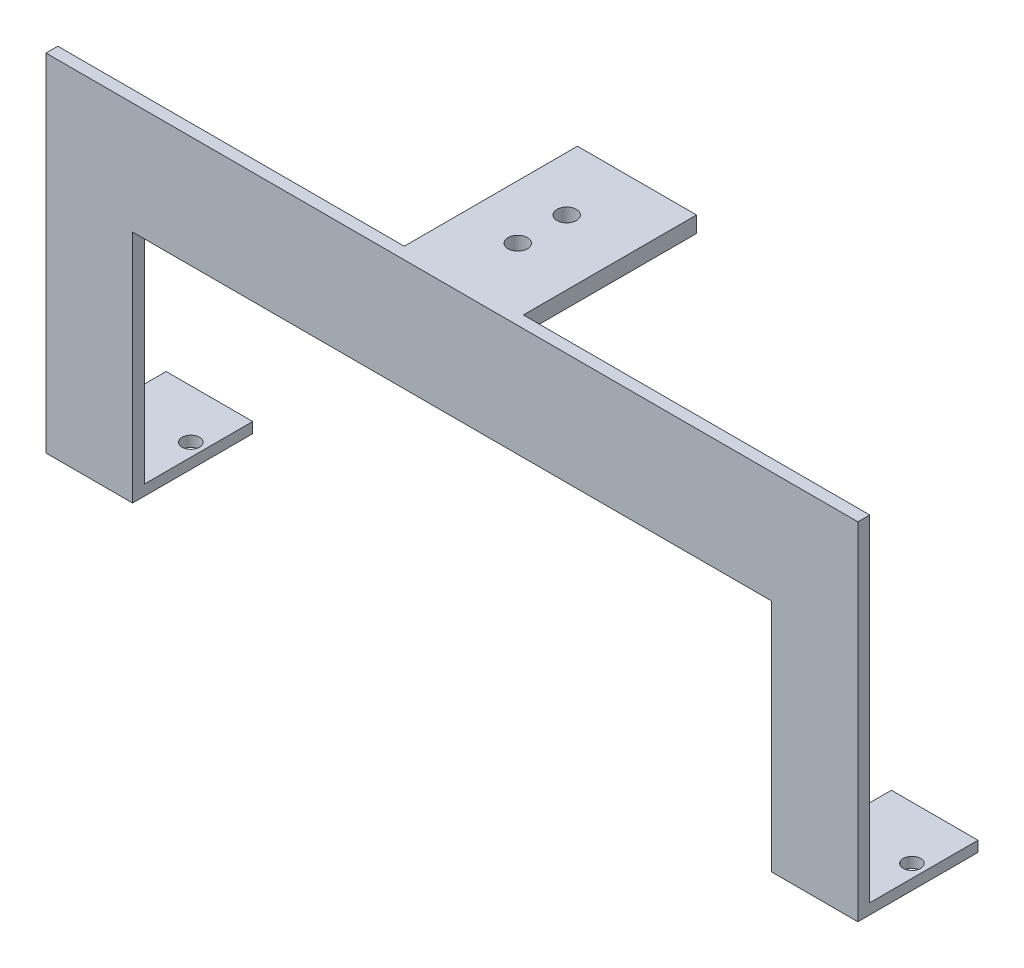
ISO-10303-21;
HEADER;
FILE_DESCRIPTION(('STEP AP214'),'2;1');
FILE_NAME('part.step','',(''),(''),'','','');
FILE_SCHEMA(('AUTOMOTIVE_DESIGN { 1 0 10303 214 1 1 1 1 }'));
ENDSEC;
DATA;
#1=APPLICATION_CONTEXT('core data for automotive mechanical design processes');
#2=APPLICATION_PROTOCOL_DEFINITION('international standard','automotive_design',2000,#1);
#3=PRODUCT_CONTEXT('',#1,'mechanical');
#4=PRODUCT('Part','Part','',(#3));
#5=PRODUCT_RELATED_PRODUCT_CATEGORY('part','',(#4));
#6=PRODUCT_DEFINITION_FORMATION('','',#4);
#7=PRODUCT_DEFINITION_CONTEXT('part definition',#1,'design');
#8=PRODUCT_DEFINITION('design','',#6,#7);
#9=PRODUCT_DEFINITION_SHAPE('','',#8);
#10=(LENGTH_UNIT() NAMED_UNIT(*) SI_UNIT(.MILLI.,.METRE.));
#11=(NAMED_UNIT(*) PLANE_ANGLE_UNIT() SI_UNIT($,.RADIAN.));
#12=(NAMED_UNIT(*) SI_UNIT($,.STERADIAN.) SOLID_ANGLE_UNIT());
#13=UNCERTAINTY_MEASURE_WITH_UNIT(LENGTH_MEASURE(1.E-05),#10,'distance_accuracy_value','');
#14=(GEOMETRIC_REPRESENTATION_CONTEXT(3) GLOBAL_UNCERTAINTY_ASSIGNED_CONTEXT((#13)) GLOBAL_UNIT_ASSIGNED_CONTEXT((#10,
#11,#12)) REPRESENTATION_CONTEXT('',''));
#15=CARTESIAN_POINT('',(0.,0.,0.));
#16=DIRECTION('',(0.,0.,1.));
#17=DIRECTION('',(1.,0.,0.));
#18=AXIS2_PLACEMENT_3D('',#15,#16,#17);
#19=CARTESIAN_POINT('',(0.,0.,0.));
#20=DIRECTION('',(0.,0.,1.));
#21=DIRECTION('',(1.,0.,0.));
#22=AXIS2_PLACEMENT_3D('',#19,#20,#21);
#23=PLANE('',#22);
#24=DIRECTION('',(0.,-1.,0.));
#25=VECTOR('',#24,1.);
#26=CARTESIAN_POINT('',(-37.7295436567423,75.8708638880561,0.));
#27=LINE('',#26,#25);
#28=CARTESIAN_POINT('',(-37.7295436567423,75.8708638880561,0.));
#29=VERTEX_POINT('',#28);
#30=CARTESIAN_POINT('',(-37.7295436567423,71.1610408886543,0.));
#31=VERTEX_POINT('',#30);
#32=EDGE_CURVE('E171',#29,#31,#27,.T.);
#33=ORIENTED_EDGE('',*,*,#32,.F.);
#34=DIRECTION('',(-1.,0.,0.));
#35=VECTOR('',#34,1.);
#36=CARTESIAN_POINT('',(-174.254543656742,75.870863888056,0.));
#37=LINE('',#36,#35);
#38=CARTESIAN_POINT('',(63.8704563432576,75.8708638880561,0.));
#39=VERTEX_POINT('',#38);
#40=EDGE_CURVE('E216',#39,#29,#37,.T.);
#41=ORIENTED_EDGE('',*,*,#40,.F.);
#42=DIRECTION('',(0.,1.,0.));
#43=VECTOR('',#42,1.);
#44=CARTESIAN_POINT('',(63.8704563432576,75.8708638880561,0.));
#45=LINE('',#44,#43);
#46=CARTESIAN_POINT('',(63.8704563432577,-22.6303361119439,0.));
#47=VERTEX_POINT('',#46);
#48=EDGE_CURVE('E240',#47,#39,#45,.T.);
#49=ORIENTED_EDGE('',*,*,#48,.F.);
#50=DIRECTION('',(1.,0.,0.));
#51=VECTOR('',#50,1.);
#52=CARTESIAN_POINT('',(63.8704563432577,-22.6303361119439,0.));
#53=LINE('',#52,#51);
#54=CARTESIAN_POINT('',(38.4704563432577,-22.6303361119439,0.));
#55=VERTEX_POINT('',#54);
#56=EDGE_CURVE('E192',#55,#47,#53,.T.);
#57=ORIENTED_EDGE('',*,*,#56,.F.);
#58=DIRECTION('',(0.,-1.,0.));
#59=VECTOR('',#58,1.);
#60=CARTESIAN_POINT('',(38.4704563432576,43.1046566031269,0.));
#61=LINE('',#60,#59);
#62=CARTESIAN_POINT('',(38.4704563432576,43.1046566031269,0.));
#63=VERTEX_POINT('',#62);
#64=EDGE_CURVE('E237',#63,#55,#61,.T.);
#65=ORIENTED_EDGE('',*,*,#64,.F.);
#66=DIRECTION('',(1.,0.,0.));
#67=VECTOR('',#66,1.);
#68=CARTESIAN_POINT('',(-148.854543656742,43.1046566031269,0.));
#69=LINE('',#68,#67);
#70=CARTESIAN_POINT('',(-148.854543656742,43.1046566031269,0.));
#71=VERTEX_POINT('',#70);
#72=EDGE_CURVE('E235',#71,#63,#69,.T.);
#73=ORIENTED_EDGE('',*,*,#72,.F.);
#74=DIRECTION('',(0.,1.,0.));
#75=VECTOR('',#74,1.);
#76=CARTESIAN_POINT('',(-148.854543656742,-25.7291361119439,0.));
#77=LINE('',#76,#75);
#78=CARTESIAN_POINT('',(-148.854543656742,-22.6303361119439,0.));
#79=VERTEX_POINT('',#78);
#80=EDGE_CURVE('E233',#79,#71,#77,.T.);
#81=ORIENTED_EDGE('',*,*,#80,.F.);
#82=DIRECTION('',(1.,0.,0.));
#83=VECTOR('',#82,1.);
#84=CARTESIAN_POINT('',(-148.854543656742,-22.6303361119439,0.));
#85=LINE('',#84,#83);
#86=CARTESIAN_POINT('',(-174.254543656742,-22.6303361119439,0.));
#87=VERTEX_POINT('',#86);
#88=EDGE_CURVE('E173',#87,#79,#85,.T.);
#89=ORIENTED_EDGE('',*,*,#88,.F.);
#90=DIRECTION('',(0.,-1.,0.));
#91=VECTOR('',#90,1.);
#92=CARTESIAN_POINT('',(-174.254543656742,75.870863888056,0.));
#93=LINE('',#92,#91);
#94=CARTESIAN_POINT('',(-174.254543656742,75.870863888056,0.));
#95=VERTEX_POINT('',#94);
#96=EDGE_CURVE('E211',#95,#87,#93,.T.);
#97=ORIENTED_EDGE('',*,*,#96,.F.);
#98=CARTESIAN_POINT('',(-72.6545436567424,75.870863888056,0.));
#99=VERTEX_POINT('',#98);
#100=EDGE_CURVE('E242',#99,#95,#37,.T.);
#101=ORIENTED_EDGE('',*,*,#100,.F.);
#102=DIRECTION('',(0.,1.,0.));
#103=VECTOR('',#102,1.);
#104=CARTESIAN_POINT('',(-72.6545436567424,75.870863888056,0.));
#105=LINE('',#104,#103);
#106=CARTESIAN_POINT('',(-72.6545436567424,71.1610408886543,0.));
#107=VERTEX_POINT('',#106);
#108=EDGE_CURVE('E167',#107,#99,#105,.T.);
#109=ORIENTED_EDGE('',*,*,#108,.F.);
#110=DIRECTION('',(-1.,0.,0.));
#111=VECTOR('',#110,1.);
#112=CARTESIAN_POINT('',(-37.7295436567423,71.1610408886543,0.));
#113=LINE('',#112,#111);
#114=EDGE_CURVE('E301',#31,#107,#113,.T.);
#115=ORIENTED_EDGE('',*,*,#114,.F.);
#116=EDGE_LOOP('',(#33,#41,#49,#57,#65,#73,#81,#89,#97,#101,#109,#115));
#117=FACE_BOUND('',#116,.T.);
#118=ADVANCED_FACE('F34',(#117),#23,.F.);
#119=CARTESIAN_POINT('',(-174.254543656742,75.870863888056,3.4798));
#120=DIRECTION('',(1.,0.,0.));
#121=DIRECTION('',(0.,1.,0.));
#122=AXIS2_PLACEMENT_3D('',#119,#120,#121);
#123=PLANE('',#122);
#124=ORIENTED_EDGE('',*,*,#96,.T.);
#125=DIRECTION('',(0.,0.,1.));
#126=VECTOR('',#125,1.);
#127=CARTESIAN_POINT('',(-174.254543656742,-22.6303361119439,-31.75));
#128=LINE('',#127,#126);
#129=CARTESIAN_POINT('',(-174.254543656742,-22.6303361119439,-31.75));
#130=VERTEX_POINT('',#129);
#131=EDGE_CURVE('E190',#130,#87,#128,.T.);
#132=ORIENTED_EDGE('',*,*,#131,.F.);
#133=DIRECTION('',(0.,1.,0.));
#134=VECTOR('',#133,1.);
#135=CARTESIAN_POINT('',(-174.254543656742,-22.6303361119439,-31.75));
#136=LINE('',#135,#134);
#137=CARTESIAN_POINT('',(-174.254543656742,-25.7291361119439,-31.75));
#138=VERTEX_POINT('',#137);
#139=EDGE_CURVE('E185',#138,#130,#136,.T.);
#140=ORIENTED_EDGE('',*,*,#139,.F.);
#141=DIRECTION('',(0.,0.,-1.));
#142=VECTOR('',#141,1.);
#143=CARTESIAN_POINT('',(-174.254543656742,-25.7291361119439,3.4798));
#144=LINE('',#143,#142);
#145=CARTESIAN_POINT('',(-174.254543656742,-25.7291361119439,3.4798));
#146=VERTEX_POINT('',#145);
#147=EDGE_CURVE('E11',#146,#138,#144,.T.);
#148=ORIENTED_EDGE('',*,*,#147,.F.);
#149=DIRECTION('',(0.,-1.,0.));
#150=VECTOR('',#149,1.);
#151=CARTESIAN_POINT('',(-174.254543656742,75.870863888056,3.4798));
#152=LINE('',#151,#150);
#153=CARTESIAN_POINT('',(-174.254543656742,75.870863888056,3.4798));
#154=VERTEX_POINT('',#153);
#155=EDGE_CURVE('E212',#154,#146,#152,.T.);
#156=ORIENTED_EDGE('',*,*,#155,.F.);
#157=DIRECTION('',(0.,0.,-1.));
#158=VECTOR('',#157,1.);
#159=CARTESIAN_POINT('',(-174.254543656742,75.870863888056,3.4798));
#160=LINE('',#159,#158);
#161=EDGE_CURVE('E230',#154,#95,#160,.T.);
#162=ORIENTED_EDGE('',*,*,#161,.T.);
#163=EDGE_LOOP('',(#124,#132,#140,#148,#156,#162));
#164=FACE_BOUND('',#163,.T.);
#165=ADVANCED_FACE('F36',(#164),#123,.F.);
#166=CARTESIAN_POINT('',(-174.254543656742,-25.7291361119439,3.4798));
#167=DIRECTION('',(0.,1.,0.));
#168=DIRECTION('',(0.,0.,1.));
#169=AXIS2_PLACEMENT_3D('',#166,#167,#168);
#170=PLANE('',#169);
#171=CARTESIAN_POINT('',(-152.664543656742,-25.7291361119439,-17.4042438171966));
#172=DIRECTION('',(0.,-1.,0.));
#173=DIRECTION('',(0.,0.,-1.));
#174=AXIS2_PLACEMENT_3D('',#171,#172,#173);
#175=CIRCLE('',#174,2.53999999999998);
#176=CARTESIAN_POINT('',(-152.664543656742,-25.7291361119439,-19.9442438171966));
#177=VERTEX_POINT('',#176);
#178=EDGE_CURVE('E272',#177,#177,#175,.T.);
#179=ORIENTED_EDGE('',*,*,#178,.F.);
#180=EDGE_LOOP('',(#179));
#181=FACE_BOUND('',#180,.T.);
#182=CARTESIAN_POINT('',(-170.444543656742,-25.7291361119439,-17.1376093775564));
#183=DIRECTION('',(0.,-1.,0.));
#184=DIRECTION('',(0.,0.,-1.));
#185=AXIS2_PLACEMENT_3D('',#182,#183,#184);
#186=CIRCLE('',#185,2.53999999999998);
#187=CARTESIAN_POINT('',(-170.444543656742,-25.7291361119439,-19.6776093775564));
#188=VERTEX_POINT('',#187);
#189=EDGE_CURVE('E268',#188,#188,#186,.T.);
#190=ORIENTED_EDGE('',*,*,#189,.F.);
#191=EDGE_LOOP('',(#190));
#192=FACE_BOUND('',#191,.T.);
#193=ORIENTED_EDGE('',*,*,#147,.T.);
#194=DIRECTION('',(-1.,0.,0.));
#195=VECTOR('',#194,1.);
#196=CARTESIAN_POINT('',(-148.854543656742,-25.7291361119439,-31.75));
#197=LINE('',#196,#195);
#198=CARTESIAN_POINT('',(-148.854543656742,-25.7291361119439,-31.75));
#199=VERTEX_POINT('',#198);
#200=EDGE_CURVE('E182',#199,#138,#197,.T.);
#201=ORIENTED_EDGE('',*,*,#200,.F.);
#202=DIRECTION('',(0.,0.,-1.));
#203=VECTOR('',#202,1.);
#204=CARTESIAN_POINT('',(-148.854543656742,-25.7291361119439,3.4798));
#205=LINE('',#204,#203);
#206=CARTESIAN_POINT('',(-148.854543656742,-25.7291361119439,3.4798));
#207=VERTEX_POINT('',#206);
#208=EDGE_CURVE('E43',#207,#199,#205,.T.);
#209=ORIENTED_EDGE('',*,*,#208,.F.);
#210=DIRECTION('',(1.,0.,0.));
#211=VECTOR('',#210,1.);
#212=CARTESIAN_POINT('',(-174.254543656742,-25.7291361119439,3.4798));
#213=LINE('',#212,#211);
#214=EDGE_CURVE('E215',#146,#207,#213,.T.);
#215=ORIENTED_EDGE('',*,*,#214,.F.);
#216=EDGE_LOOP('',(#193,#201,#209,#215));
#217=FACE_BOUND('',#216,.T.);
#218=ADVANCED_FACE('F343',(#181,#192,#217),#170,.F.);
#219=CARTESIAN_POINT('',(-148.854543656742,-25.7291361119439,3.4798));
#220=DIRECTION('',(-1.,0.,0.));
#221=DIRECTION('',(0.,0.,1.));
#222=AXIS2_PLACEMENT_3D('',#219,#220,#221);
#223=PLANE('',#222);
#224=ORIENTED_EDGE('',*,*,#208,.T.);
#225=DIRECTION('',(0.,-1.,0.));
#226=VECTOR('',#225,1.);
#227=CARTESIAN_POINT('',(-148.854543656742,-22.6303361119439,-31.75));
#228=LINE('',#227,#226);
#229=CARTESIAN_POINT('',(-148.854543656742,-22.6303361119439,-31.75));
#230=VERTEX_POINT('',#229);
#231=EDGE_CURVE('E175',#230,#199,#228,.T.);
#232=ORIENTED_EDGE('',*,*,#231,.F.);
#233=DIRECTION('',(0.,0.,1.));
#234=VECTOR('',#233,1.);
#235=CARTESIAN_POINT('',(-148.854543656742,-22.6303361119439,-31.75));
#236=LINE('',#235,#234);
#237=EDGE_CURVE('E59',#230,#79,#236,.T.);
#238=ORIENTED_EDGE('',*,*,#237,.T.);
#239=ORIENTED_EDGE('',*,*,#80,.T.);
#240=DIRECTION('',(0.,0.,-1.));
#241=VECTOR('',#240,1.);
#242=CARTESIAN_POINT('',(-148.854543656742,43.1046566031269,3.4798));
#243=LINE('',#242,#241);
#244=CARTESIAN_POINT('',(-148.854543656742,43.1046566031269,3.4798));
#245=VERTEX_POINT('',#244);
#246=EDGE_CURVE('E257',#245,#71,#243,.T.);
#247=ORIENTED_EDGE('',*,*,#246,.F.);
#248=DIRECTION('',(0.,1.,0.));
#249=VECTOR('',#248,1.);
#250=CARTESIAN_POINT('',(-148.854543656742,-25.7291361119439,3.4798));
#251=LINE('',#250,#249);
#252=EDGE_CURVE('E218',#207,#245,#251,.T.);
#253=ORIENTED_EDGE('',*,*,#252,.F.);
#254=EDGE_LOOP('',(#224,#232,#238,#239,#247,#253));
#255=FACE_BOUND('',#254,.T.);
#256=ADVANCED_FACE('F335',(#255),#223,.F.);
#257=CARTESIAN_POINT('',(-148.854543656742,43.1046566031269,3.4798));
#258=DIRECTION('',(0.,1.,0.));
#259=DIRECTION('',(0.,0.,1.));
#260=AXIS2_PLACEMENT_3D('',#257,#258,#259);
#261=PLANE('',#260);
#262=ORIENTED_EDGE('',*,*,#72,.T.);
#263=DIRECTION('',(0.,0.,-1.));
#264=VECTOR('',#263,1.);
#265=CARTESIAN_POINT('',(38.4704563432576,43.1046566031269,3.4798));
#266=LINE('',#265,#264);
#267=CARTESIAN_POINT('',(38.4704563432576,43.1046566031269,3.4798));
#268=VERTEX_POINT('',#267);
#269=EDGE_CURVE('E254',#268,#63,#266,.T.);
#270=ORIENTED_EDGE('',*,*,#269,.F.);
#271=DIRECTION('',(1.,0.,0.));
#272=VECTOR('',#271,1.);
#273=CARTESIAN_POINT('',(-148.854543656742,43.1046566031269,3.4798));
#274=LINE('',#273,#272);
#275=EDGE_CURVE('E220',#245,#268,#274,.T.);
#276=ORIENTED_EDGE('',*,*,#275,.F.);
#277=ORIENTED_EDGE('',*,*,#246,.T.);
#278=EDGE_LOOP('',(#262,#270,#276,#277));
#279=FACE_BOUND('',#278,.T.);
#280=ADVANCED_FACE('F331',(#279),#261,.F.);
#281=CARTESIAN_POINT('',(38.4704563432576,43.1046566031269,3.4798));
#282=DIRECTION('',(1.,0.,0.));
#283=DIRECTION('',(0.,1.,0.));
#284=AXIS2_PLACEMENT_3D('',#281,#282,#283);
#285=PLANE('',#284);
#286=ORIENTED_EDGE('',*,*,#64,.T.);
#287=DIRECTION('',(0.,0.,1.));
#288=VECTOR('',#287,1.);
#289=CARTESIAN_POINT('',(38.4704563432576,-22.6303361119439,-31.75));
#290=LINE('',#289,#288);
#291=CARTESIAN_POINT('',(38.4704563432576,-22.6303361119439,-31.75));
#292=VERTEX_POINT('',#291);
#293=EDGE_CURVE('E208',#292,#55,#290,.T.);
#294=ORIENTED_EDGE('',*,*,#293,.F.);
#295=DIRECTION('',(0.,1.,0.));
#296=VECTOR('',#295,1.);
#297=CARTESIAN_POINT('',(38.4704563432576,-25.7291361119439,-31.75));
#298=LINE('',#297,#296);
#299=CARTESIAN_POINT('',(38.4704563432576,-25.7291361119439,-31.75));
#300=VERTEX_POINT('',#299);
#301=EDGE_CURVE('E199',#300,#292,#298,.T.);
#302=ORIENTED_EDGE('',*,*,#301,.F.);
#303=DIRECTION('',(0.,0.,-1.));
#304=VECTOR('',#303,1.);
#305=CARTESIAN_POINT('',(38.4704563432577,-25.7291361119439,3.4798));
#306=LINE('',#305,#304);
#307=CARTESIAN_POINT('',(38.4704563432577,-25.7291361119439,3.4798));
#308=VERTEX_POINT('',#307);
#309=EDGE_CURVE('E252',#308,#300,#306,.T.);
#310=ORIENTED_EDGE('',*,*,#309,.F.);
#311=DIRECTION('',(0.,-1.,0.));
#312=VECTOR('',#311,1.);
#313=CARTESIAN_POINT('',(38.4704563432576,43.1046566031269,3.4798));
#314=LINE('',#313,#312);
#315=EDGE_CURVE('E222',#268,#308,#314,.T.);
#316=ORIENTED_EDGE('',*,*,#315,.F.);
#317=ORIENTED_EDGE('',*,*,#269,.T.);
#318=EDGE_LOOP('',(#286,#294,#302,#310,#316,#317));
#319=FACE_BOUND('',#318,.T.);
#320=ADVANCED_FACE('F323',(#319),#285,.F.);
#321=CARTESIAN_POINT('',(38.4704563432577,-25.7291361119439,3.4798));
#322=DIRECTION('',(0.,1.,0.));
#323=DIRECTION('',(-1.,0.,0.));
#324=AXIS2_PLACEMENT_3D('',#321,#322,#323);
#325=PLANE('',#324);
#326=CARTESIAN_POINT('',(60.0604563432576,-25.7291361119439,-16.178164824197));
#327=DIRECTION('',(0.,-1.,0.));
#328=DIRECTION('',(0.,0.,-1.));
#329=AXIS2_PLACEMENT_3D('',#326,#327,#328);
#330=CIRCLE('',#329,2.54);
#331=CARTESIAN_POINT('',(60.0604563432576,-25.7291361119439,-18.718164824197));
#332=VERTEX_POINT('',#331);
#333=EDGE_CURVE('E275',#332,#332,#330,.T.);
#334=ORIENTED_EDGE('',*,*,#333,.F.);
#335=EDGE_LOOP('',(#334));
#336=FACE_BOUND('',#335,.T.);
#337=CARTESIAN_POINT('',(42.2804563432577,-25.7291361119439,-15.39391859977));
#338=DIRECTION('',(0.,-1.,0.));
#339=DIRECTION('',(0.,0.,-1.));
#340=AXIS2_PLACEMENT_3D('',#337,#338,#339);
#341=CIRCLE('',#340,2.54);
#342=CARTESIAN_POINT('',(42.2804563432577,-25.7291361119439,-17.93391859977));
#343=VERTEX_POINT('',#342);
#344=EDGE_CURVE('E264',#343,#343,#341,.T.);
#345=ORIENTED_EDGE('',*,*,#344,.F.);
#346=EDGE_LOOP('',(#345));
#347=FACE_BOUND('',#346,.T.);
#348=ORIENTED_EDGE('',*,*,#309,.T.);
#349=DIRECTION('',(-1.,0.,0.));
#350=VECTOR('',#349,1.);
#351=CARTESIAN_POINT('',(63.8704563432577,-25.7291361119439,-31.75));
#352=LINE('',#351,#350);
#353=CARTESIAN_POINT('',(63.8704563432577,-25.7291361119439,-31.75));
#354=VERTEX_POINT('',#353);
#355=EDGE_CURVE('E196',#354,#300,#352,.T.);
#356=ORIENTED_EDGE('',*,*,#355,.F.);
#357=DIRECTION('',(0.,0.,-1.));
#358=VECTOR('',#357,1.);
#359=CARTESIAN_POINT('',(63.8704563432577,-25.7291361119439,3.4798));
#360=LINE('',#359,#358);
#361=CARTESIAN_POINT('',(63.8704563432577,-25.7291361119439,3.4798));
#362=VERTEX_POINT('',#361);
#363=EDGE_CURVE('E250',#362,#354,#360,.T.);
#364=ORIENTED_EDGE('',*,*,#363,.F.);
#365=DIRECTION('',(1.,0.,0.));
#366=VECTOR('',#365,1.);
#367=CARTESIAN_POINT('',(38.4704563432577,-25.7291361119439,3.4798));
#368=LINE('',#367,#366);
#369=EDGE_CURVE('E224',#308,#362,#368,.T.);
#370=ORIENTED_EDGE('',*,*,#369,.F.);
#371=EDGE_LOOP('',(#348,#356,#364,#370));
#372=FACE_BOUND('',#371,.T.);
#373=ADVANCED_FACE('F379',(#336,#347,#372),#325,.F.);
#374=CARTESIAN_POINT('',(63.8704563432576,75.8708638880561,3.4798));
#375=DIRECTION('',(-1.,0.,0.));
#376=DIRECTION('',(0.,-1.,0.));
#377=AXIS2_PLACEMENT_3D('',#374,#375,#376);
#378=PLANE('',#377);
#379=ORIENTED_EDGE('',*,*,#363,.T.);
#380=DIRECTION('',(0.,-1.,0.));
#381=VECTOR('',#380,1.);
#382=CARTESIAN_POINT('',(63.8704563432577,-25.7291361119439,-31.75));
#383=LINE('',#382,#381);
#384=CARTESIAN_POINT('',(63.8704563432577,-22.6303361119439,-31.75));
#385=VERTEX_POINT('',#384);
#386=EDGE_CURVE('E193',#385,#354,#383,.T.);
#387=ORIENTED_EDGE('',*,*,#386,.F.);
#388=DIRECTION('',(0.,0.,1.));
#389=VECTOR('',#388,1.);
#390=CARTESIAN_POINT('',(63.8704563432577,-22.6303361119439,-31.75));
#391=LINE('',#390,#389);
#392=EDGE_CURVE('E203',#385,#47,#391,.T.);
#393=ORIENTED_EDGE('',*,*,#392,.T.);
#394=ORIENTED_EDGE('',*,*,#48,.T.);
#395=DIRECTION('',(0.,0.,-1.));
#396=VECTOR('',#395,1.);
#397=CARTESIAN_POINT('',(63.8704563432576,75.8708638880561,3.4798));
#398=LINE('',#397,#396);
#399=CARTESIAN_POINT('',(63.8704563432576,75.8708638880561,3.4798));
#400=VERTEX_POINT('',#399);
#401=EDGE_CURVE('E247',#400,#39,#398,.T.);
#402=ORIENTED_EDGE('',*,*,#401,.F.);
#403=DIRECTION('',(0.,1.,0.));
#404=VECTOR('',#403,1.);
#405=CARTESIAN_POINT('',(63.8704563432576,75.8708638880561,3.4798));
#406=LINE('',#405,#404);
#407=EDGE_CURVE('E226',#362,#400,#406,.T.);
#408=ORIENTED_EDGE('',*,*,#407,.F.);
#409=EDGE_LOOP('',(#379,#387,#393,#394,#402,#408));
#410=FACE_BOUND('',#409,.T.);
#411=ADVANCED_FACE('F313',(#410),#378,.F.);
#412=CARTESIAN_POINT('',(-174.254543656742,75.870863888056,3.4798));
#413=DIRECTION('',(0.,-1.,0.));
#414=DIRECTION('',(1.,0.,0.));
#415=AXIS2_PLACEMENT_3D('',#412,#413,#414);
#416=PLANE('',#415);
#417=CARTESIAN_POINT('',(-56.7795436567423,75.8708638880561,-31.75));
#418=DIRECTION('',(0.,1.,0.));
#419=DIRECTION('',(-1.,0.,0.));
#420=AXIS2_PLACEMENT_3D('',#417,#418,#419);
#421=CIRCLE('',#420,2.84697601604509);
#422=CARTESIAN_POINT('',(-59.6265196727874,75.8708638880561,-31.75));
#423=VERTEX_POINT('',#422);
#424=EDGE_CURVE('E288',#423,#423,#421,.T.);
#425=ORIENTED_EDGE('',*,*,#424,.F.);
#426=EDGE_LOOP('',(#425));
#427=FACE_BOUND('',#426,.T.);
#428=CARTESIAN_POINT('',(-56.7795436567423,75.8708638880561,-17.4131788194138));
#429=DIRECTION('',(0.,1.,0.));
#430=DIRECTION('',(-1.,0.,0.));
#431=AXIS2_PLACEMENT_3D('',#428,#429,#430);
#432=CIRCLE('',#431,2.84302599920627);
#433=CARTESIAN_POINT('',(-59.6225696559486,75.8708638880561,-17.4131788194138));
#434=VERTEX_POINT('',#433);
#435=EDGE_CURVE('E278',#434,#434,#432,.T.);
#436=ORIENTED_EDGE('',*,*,#435,.F.);
#437=EDGE_LOOP('',(#436));
#438=FACE_BOUND('',#437,.T.);
#439=ORIENTED_EDGE('',*,*,#40,.T.);
#440=DIRECTION('',(0.,0.,1.));
#441=VECTOR('',#440,1.);
#442=CARTESIAN_POINT('',(-37.7295436567423,75.8708638880561,-50.8));
#443=LINE('',#442,#441);
#444=CARTESIAN_POINT('',(-37.7295436567423,75.8708638880561,-50.8));
#445=VERTEX_POINT('',#444);
#446=EDGE_CURVE('E299',#445,#29,#443,.T.);
#447=ORIENTED_EDGE('',*,*,#446,.F.);
#448=DIRECTION('',(1.,0.,0.));
#449=VECTOR('',#448,1.);
#450=CARTESIAN_POINT('',(-37.7295436567423,75.8708638880561,-50.8));
#451=LINE('',#450,#449);
#452=CARTESIAN_POINT('',(-72.6545436567424,75.870863888056,-50.8));
#453=VERTEX_POINT('',#452);
#454=EDGE_CURVE('E164',#453,#445,#451,.T.);
#455=ORIENTED_EDGE('',*,*,#454,.F.);
#456=DIRECTION('',(0.,0.,1.));
#457=VECTOR('',#456,1.);
#458=CARTESIAN_POINT('',(-72.6545436567424,75.870863888056,-50.8));
#459=LINE('',#458,#457);
#460=EDGE_CURVE('E51',#453,#99,#459,.T.);
#461=ORIENTED_EDGE('',*,*,#460,.T.);
#462=ORIENTED_EDGE('',*,*,#100,.T.);
#463=ORIENTED_EDGE('',*,*,#161,.F.);
#464=DIRECTION('',(-1.,0.,0.));
#465=VECTOR('',#464,1.);
#466=CARTESIAN_POINT('',(-174.254543656742,75.870863888056,3.4798));
#467=LINE('',#466,#465);
#468=EDGE_CURVE('E228',#400,#154,#467,.T.);
#469=ORIENTED_EDGE('',*,*,#468,.F.);
#470=ORIENTED_EDGE('',*,*,#401,.T.);
#471=EDGE_LOOP('',(#439,#447,#455,#461,#462,#463,#469,#470));
#472=FACE_BOUND('',#471,.T.);
#473=ADVANCED_FACE('F307',(#427,#438,#472),#416,.F.);
#474=CARTESIAN_POINT('',(0.,0.,3.4798));
#475=DIRECTION('',(0.,0.,1.));
#476=DIRECTION('',(1.,0.,0.));
#477=AXIS2_PLACEMENT_3D('',#474,#475,#476);
#478=PLANE('',#477);
#479=ORIENTED_EDGE('',*,*,#155,.T.);
#480=ORIENTED_EDGE('',*,*,#214,.T.);
#481=ORIENTED_EDGE('',*,*,#252,.T.);
#482=ORIENTED_EDGE('',*,*,#275,.T.);
#483=ORIENTED_EDGE('',*,*,#315,.T.);
#484=ORIENTED_EDGE('',*,*,#369,.T.);
#485=ORIENTED_EDGE('',*,*,#407,.T.);
#486=ORIENTED_EDGE('',*,*,#468,.T.);
#487=EDGE_LOOP('',(#479,#480,#481,#482,#483,#484,#485,#486));
#488=FACE_BOUND('',#487,.T.);
#489=ADVANCED_FACE('F339',(#488),#478,.T.);
#490=CARTESIAN_POINT('',(63.8704563432577,-22.6303361119439,-31.75));
#491=DIRECTION('',(0.,-1.,0.));
#492=DIRECTION('',(0.,0.,-1.));
#493=AXIS2_PLACEMENT_3D('',#490,#491,#492);
#494=PLANE('',#493);
#495=CARTESIAN_POINT('',(60.0604563432576,-22.6303361119439,-16.178164824197));
#496=DIRECTION('',(0.,-1.,0.));
#497=DIRECTION('',(0.,0.,-1.));
#498=AXIS2_PLACEMENT_3D('',#495,#496,#497);
#499=CIRCLE('',#498,2.54);
#500=CARTESIAN_POINT('',(60.0604563432576,-22.6303361119439,-18.718164824197));
#501=VERTEX_POINT('',#500);
#502=EDGE_CURVE('E273',#501,#501,#499,.T.);
#503=ORIENTED_EDGE('',*,*,#502,.T.);
#504=EDGE_LOOP('',(#503));
#505=FACE_BOUND('',#504,.T.);
#506=CARTESIAN_POINT('',(42.2804563432577,-22.6303361119439,-15.39391859977));
#507=DIRECTION('',(0.,-1.,0.));
#508=DIRECTION('',(0.,0.,-1.));
#509=AXIS2_PLACEMENT_3D('',#506,#507,#508);
#510=CIRCLE('',#509,2.54);
#511=CARTESIAN_POINT('',(42.2804563432577,-22.6303361119439,-17.93391859977));
#512=VERTEX_POINT('',#511);
#513=EDGE_CURVE('E261',#512,#512,#510,.T.);
#514=ORIENTED_EDGE('',*,*,#513,.T.);
#515=EDGE_LOOP('',(#514));
#516=FACE_BOUND('',#515,.T.);
#517=ORIENTED_EDGE('',*,*,#56,.T.);
#518=ORIENTED_EDGE('',*,*,#392,.F.);
#519=DIRECTION('',(1.,0.,0.));
#520=VECTOR('',#519,1.);
#521=CARTESIAN_POINT('',(63.8704563432577,-22.6303361119439,-31.75));
#522=LINE('',#521,#520);
#523=EDGE_CURVE('E201',#292,#385,#522,.T.);
#524=ORIENTED_EDGE('',*,*,#523,.F.);
#525=ORIENTED_EDGE('',*,*,#293,.T.);
#526=EDGE_LOOP('',(#517,#518,#524,#525));
#527=FACE_BOUND('',#526,.T.);
#528=ADVANCED_FACE('F318',(#505,#516,#527),#494,.F.);
#529=CARTESIAN_POINT('',(0.,0.,-31.75));
#530=DIRECTION('',(0.,0.,1.));
#531=DIRECTION('',(1.,0.,0.));
#532=AXIS2_PLACEMENT_3D('',#529,#530,#531);
#533=PLANE('',#532);
#534=ORIENTED_EDGE('',*,*,#386,.T.);
#535=ORIENTED_EDGE('',*,*,#355,.T.);
#536=ORIENTED_EDGE('',*,*,#301,.T.);
#537=ORIENTED_EDGE('',*,*,#523,.T.);
#538=EDGE_LOOP('',(#534,#535,#536,#537));
#539=FACE_BOUND('',#538,.T.);
#540=ADVANCED_FACE('F404',(#539),#533,.F.);
#541=CARTESIAN_POINT('',(-148.854543656742,-22.6303361119439,-31.75));
#542=DIRECTION('',(0.,-1.,0.));
#543=DIRECTION('',(0.,0.,-1.));
#544=AXIS2_PLACEMENT_3D('',#541,#542,#543);
#545=PLANE('',#544);
#546=CARTESIAN_POINT('',(-152.664543656742,-22.6303361119439,-17.4042438171966));
#547=DIRECTION('',(0.,-1.,0.));
#548=DIRECTION('',(0.,0.,-1.));
#549=AXIS2_PLACEMENT_3D('',#546,#547,#548);
#550=CIRCLE('',#549,2.53999999999998);
#551=CARTESIAN_POINT('',(-152.664543656742,-22.6303361119439,-19.9442438171966));
#552=VERTEX_POINT('',#551);
#553=EDGE_CURVE('E269',#552,#552,#550,.T.);
#554=ORIENTED_EDGE('',*,*,#553,.T.);
#555=EDGE_LOOP('',(#554));
#556=FACE_BOUND('',#555,.T.);
#557=CARTESIAN_POINT('',(-170.444543656742,-22.6303361119439,-17.1376093775564));
#558=DIRECTION('',(0.,-1.,0.));
#559=DIRECTION('',(0.,0.,-1.));
#560=AXIS2_PLACEMENT_3D('',#557,#558,#559);
#561=CIRCLE('',#560,2.53999999999998);
#562=CARTESIAN_POINT('',(-170.444543656742,-22.6303361119439,-19.6776093775564));
#563=VERTEX_POINT('',#562);
#564=EDGE_CURVE('E265',#563,#563,#561,.T.);
#565=ORIENTED_EDGE('',*,*,#564,.T.);
#566=EDGE_LOOP('',(#565));
#567=FACE_BOUND('',#566,.T.);
#568=ORIENTED_EDGE('',*,*,#88,.T.);
#569=ORIENTED_EDGE('',*,*,#237,.F.);
#570=DIRECTION('',(1.,0.,0.));
#571=VECTOR('',#570,1.);
#572=CARTESIAN_POINT('',(-148.854543656742,-22.6303361119439,-31.75));
#573=LINE('',#572,#571);
#574=EDGE_CURVE('E187',#130,#230,#573,.T.);
#575=ORIENTED_EDGE('',*,*,#574,.F.);
#576=ORIENTED_EDGE('',*,*,#131,.T.);
#577=EDGE_LOOP('',(#568,#569,#575,#576));
#578=FACE_BOUND('',#577,.T.);
#579=ADVANCED_FACE('F350',(#556,#567,#578),#545,.F.);
#580=CARTESIAN_POINT('',(0.,0.,-31.75));
#581=DIRECTION('',(0.,0.,-1.));
#582=DIRECTION('',(-1.,0.,0.));
#583=AXIS2_PLACEMENT_3D('',#580,#581,#582);
#584=PLANE('',#583);
#585=ORIENTED_EDGE('',*,*,#231,.T.);
#586=ORIENTED_EDGE('',*,*,#200,.T.);
#587=ORIENTED_EDGE('',*,*,#139,.T.);
#588=ORIENTED_EDGE('',*,*,#574,.T.);
#589=EDGE_LOOP('',(#585,#586,#587,#588));
#590=FACE_BOUND('',#589,.T.);
#591=ADVANCED_FACE('F346',(#590),#584,.T.);
#592=CARTESIAN_POINT('',(-37.7295436567423,75.8708638880561,-50.8));
#593=DIRECTION('',(-1.,0.,0.));
#594=DIRECTION('',(0.,0.,1.));
#595=AXIS2_PLACEMENT_3D('',#592,#593,#594);
#596=PLANE('',#595);
#597=ORIENTED_EDGE('',*,*,#32,.T.);
#598=DIRECTION('',(0.,0.,1.));
#599=VECTOR('',#598,1.);
#600=CARTESIAN_POINT('',(-37.7295436567423,71.1610408886543,-50.8));
#601=LINE('',#600,#599);
#602=CARTESIAN_POINT('',(-37.7295436567423,71.1610408886543,-50.8));
#603=VERTEX_POINT('',#602);
#604=EDGE_CURVE('E153',#603,#31,#601,.T.);
#605=ORIENTED_EDGE('',*,*,#604,.F.);
#606=DIRECTION('',(0.,-1.,0.));
#607=VECTOR('',#606,1.);
#608=CARTESIAN_POINT('',(-37.7295436567423,75.8708638880561,-50.8));
#609=LINE('',#608,#607);
#610=EDGE_CURVE('E160',#445,#603,#609,.T.);
#611=ORIENTED_EDGE('',*,*,#610,.F.);
#612=ORIENTED_EDGE('',*,*,#446,.T.);
#613=EDGE_LOOP('',(#597,#605,#611,#612));
#614=FACE_BOUND('',#613,.T.);
#615=ADVANCED_FACE('F169',(#614),#596,.F.);
#616=CARTESIAN_POINT('',(-37.7295436567423,71.1610408886543,-50.8));
#617=DIRECTION('',(0.,1.,0.));
#618=DIRECTION('',(0.,0.,1.));
#619=AXIS2_PLACEMENT_3D('',#616,#617,#618);
#620=PLANE('',#619);
#621=CARTESIAN_POINT('',(-56.7795436567423,71.1610408886543,-31.75));
#622=DIRECTION('',(0.,1.,0.));
#623=DIRECTION('',(0.,0.,1.));
#624=AXIS2_PLACEMENT_3D('',#621,#622,#623);
#625=CIRCLE('',#624,2.84697601604509);
#626=CARTESIAN_POINT('',(-56.7795436567423,71.1610408886543,-28.9030239839549));
#627=VERTEX_POINT('',#626);
#628=EDGE_CURVE('E38',#627,#627,#625,.T.);
#629=ORIENTED_EDGE('',*,*,#628,.T.);
#630=EDGE_LOOP('',(#629));
#631=FACE_BOUND('',#630,.T.);
#632=CARTESIAN_POINT('',(-56.7795436567423,71.1610408886543,-17.4131788194138));
#633=DIRECTION('',(0.,1.,0.));
#634=DIRECTION('',(0.,0.,1.));
#635=AXIS2_PLACEMENT_3D('',#632,#633,#634);
#636=CIRCLE('',#635,2.84302599920627);
#637=CARTESIAN_POINT('',(-59.6225696559486,71.1610408886543,-17.4131788194138));
#638=VERTEX_POINT('',#637);
#639=EDGE_CURVE('E276',#638,#638,#636,.T.);
#640=ORIENTED_EDGE('',*,*,#639,.T.);
#641=EDGE_LOOP('',(#640));
#642=FACE_BOUND('',#641,.T.);
#643=ORIENTED_EDGE('',*,*,#114,.T.);
#644=DIRECTION('',(0.,0.,1.));
#645=VECTOR('',#644,1.);
#646=CARTESIAN_POINT('',(-72.6545436567424,71.1610408886543,-50.8));
#647=LINE('',#646,#645);
#648=CARTESIAN_POINT('',(-72.6545436567424,71.1610408886543,-50.8));
#649=VERTEX_POINT('',#648);
#650=EDGE_CURVE('E156',#649,#107,#647,.T.);
#651=ORIENTED_EDGE('',*,*,#650,.F.);
#652=DIRECTION('',(-1.,0.,0.));
#653=VECTOR('',#652,1.);
#654=CARTESIAN_POINT('',(-37.7295436567423,71.1610408886543,-50.8));
#655=LINE('',#654,#653);
#656=EDGE_CURVE('E149',#603,#649,#655,.T.);
#657=ORIENTED_EDGE('',*,*,#656,.F.);
#658=ORIENTED_EDGE('',*,*,#604,.T.);
#659=EDGE_LOOP('',(#643,#651,#657,#658));
#660=FACE_BOUND('',#659,.T.);
#661=ADVANCED_FACE('F151',(#631,#642,#660),#620,.F.);
#662=CARTESIAN_POINT('',(-72.6545436567424,75.870863888056,-50.8));
#663=DIRECTION('',(1.,0.,0.));
#664=DIRECTION('',(0.,0.,-1.));
#665=AXIS2_PLACEMENT_3D('',#662,#663,#664);
#666=PLANE('',#665);
#667=ORIENTED_EDGE('',*,*,#108,.T.);
#668=ORIENTED_EDGE('',*,*,#460,.F.);
#669=DIRECTION('',(0.,1.,0.));
#670=VECTOR('',#669,1.);
#671=CARTESIAN_POINT('',(-72.6545436567424,75.870863888056,-50.8));
#672=LINE('',#671,#670);
#673=EDGE_CURVE('E159',#649,#453,#672,.T.);
#674=ORIENTED_EDGE('',*,*,#673,.F.);
#675=ORIENTED_EDGE('',*,*,#650,.T.);
#676=EDGE_LOOP('',(#667,#668,#674,#675));
#677=FACE_BOUND('',#676,.T.);
#678=ADVANCED_FACE('F355',(#677),#666,.F.);
#679=CARTESIAN_POINT('',(0.,0.,-50.8));
#680=DIRECTION('',(0.,0.,-1.));
#681=DIRECTION('',(-1.,0.,0.));
#682=AXIS2_PLACEMENT_3D('',#679,#680,#681);
#683=PLANE('',#682);
#684=ORIENTED_EDGE('',*,*,#610,.T.);
#685=ORIENTED_EDGE('',*,*,#656,.T.);
#686=ORIENTED_EDGE('',*,*,#673,.T.);
#687=ORIENTED_EDGE('',*,*,#454,.T.);
#688=EDGE_LOOP('',(#684,#685,#686,#687));
#689=FACE_BOUND('',#688,.T.);
#690=ADVANCED_FACE('F163',(#689),#683,.T.);
#691=CARTESIAN_POINT('',(42.2804563432577,75.8708638880561,-15.39391859977));
#692=DIRECTION('',(0.,-1.,0.));
#693=DIRECTION('',(0.,0.,-1.));
#694=AXIS2_PLACEMENT_3D('',#691,#692,#693);
#695=CYLINDRICAL_SURFACE('',#694,2.54);
#696=ORIENTED_EDGE('',*,*,#344,.T.);
#697=EDGE_LOOP('',(#696));
#698=FACE_BOUND('',#697,.T.);
#699=ORIENTED_EDGE('',*,*,#513,.F.);
#700=EDGE_LOOP('',(#699));
#701=FACE_BOUND('',#700,.T.);
#702=ADVANCED_FACE('F362',(#698,#701),#695,.F.);
#703=CARTESIAN_POINT('',(-170.444543656742,75.870863888056,-17.1376093775564));
#704=DIRECTION('',(0.,-1.,0.));
#705=DIRECTION('',(0.,0.,-1.));
#706=AXIS2_PLACEMENT_3D('',#703,#704,#705);
#707=CYLINDRICAL_SURFACE('',#706,2.53999999999998);
#708=ORIENTED_EDGE('',*,*,#189,.T.);
#709=EDGE_LOOP('',(#708));
#710=FACE_BOUND('',#709,.T.);
#711=ORIENTED_EDGE('',*,*,#564,.F.);
#712=EDGE_LOOP('',(#711));
#713=FACE_BOUND('',#712,.T.);
#714=ADVANCED_FACE('F396',(#710,#713),#707,.F.);
#715=CARTESIAN_POINT('',(-152.664543656742,75.870863888056,-17.4042438171966));
#716=DIRECTION('',(0.,-1.,0.));
#717=DIRECTION('',(0.,0.,-1.));
#718=AXIS2_PLACEMENT_3D('',#715,#716,#717);
#719=CYLINDRICAL_SURFACE('',#718,2.53999999999998);
#720=ORIENTED_EDGE('',*,*,#178,.T.);
#721=EDGE_LOOP('',(#720));
#722=FACE_BOUND('',#721,.T.);
#723=ORIENTED_EDGE('',*,*,#553,.F.);
#724=EDGE_LOOP('',(#723));
#725=FACE_BOUND('',#724,.T.);
#726=ADVANCED_FACE('F399',(#722,#725),#719,.F.);
#727=CARTESIAN_POINT('',(60.0604563432576,25.0708638880561,-16.178164824197));
#728=DIRECTION('',(0.,-1.,0.));
#729=DIRECTION('',(0.,0.,-1.));
#730=AXIS2_PLACEMENT_3D('',#727,#728,#729);
#731=CYLINDRICAL_SURFACE('',#730,2.54);
#732=ORIENTED_EDGE('',*,*,#333,.T.);
#733=EDGE_LOOP('',(#732));
#734=FACE_BOUND('',#733,.T.);
#735=ORIENTED_EDGE('',*,*,#502,.F.);
#736=EDGE_LOOP('',(#735));
#737=FACE_BOUND('',#736,.T.);
#738=ADVANCED_FACE('F432',(#734,#737),#731,.F.);
#739=CARTESIAN_POINT('',(-56.7795436567423,-25.7291361119439,-17.4131788194138));
#740=DIRECTION('',(0.,1.,0.));
#741=DIRECTION('',(-1.,0.,0.));
#742=AXIS2_PLACEMENT_3D('',#739,#740,#741);
#743=CYLINDRICAL_SURFACE('',#742,2.84302599920627);
#744=CARTESIAN_POINT('',(-59.6225696559486,75.8708638880561,-17.4131788194138));
#745=CARTESIAN_POINT('',(-59.6225696559486,75.8218032318123,-17.4131788194138));
#746=CARTESIAN_POINT('',(-59.6225696559486,75.7727425755685,-17.4131788194138));
#747=CARTESIAN_POINT('',(-59.6225696559486,75.674621263081,-17.4131788194138));
#748=CARTESIAN_POINT('',(-59.6225696559486,75.6255606068372,-17.4131788194138));
#749=CARTESIAN_POINT('',(-59.6225696559486,75.5274392943497,-17.4131788194138));
#750=CARTESIAN_POINT('',(-59.6225696559486,75.4783786381059,-17.4131788194138));
#751=CARTESIAN_POINT('',(-59.6225696559486,75.3802573256184,-17.4131788194138));
#752=CARTESIAN_POINT('',(-59.6225696559486,75.3311966693746,-17.4131788194138));
#753=CARTESIAN_POINT('',(-59.6225696559486,75.2330753568871,-17.4131788194138));
#754=CARTESIAN_POINT('',(-59.6225696559486,75.1840147006433,-17.4131788194138));
#755=CARTESIAN_POINT('',(-59.6225696559486,75.0858933881558,-17.4131788194138));
#756=CARTESIAN_POINT('',(-59.6225696559486,75.036832731912,-17.4131788194138));
#757=CARTESIAN_POINT('',(-59.6225696559486,74.9387114194245,-17.4131788194138));
#758=CARTESIAN_POINT('',(-59.6225696559486,74.8896507631807,-17.4131788194138));
#759=CARTESIAN_POINT('',(-59.6225696559486,74.7915294506932,-17.4131788194138));
#760=CARTESIAN_POINT('',(-59.6225696559486,74.7424687944494,-17.4131788194138));
#761=CARTESIAN_POINT('',(-59.6225696559486,74.6443474819618,-17.4131788194138));
#762=CARTESIAN_POINT('',(-59.6225696559486,74.5952868257181,-17.4131788194138));
#763=CARTESIAN_POINT('',(-59.6225696559486,74.4971655132305,-17.4131788194138));
#764=CARTESIAN_POINT('',(-59.6225696559486,74.4481048569868,-17.4131788194138));
#765=CARTESIAN_POINT('',(-59.6225696559486,74.3499835444992,-17.4131788194138));
#766=CARTESIAN_POINT('',(-59.6225696559486,74.3009228882555,-17.4131788194138));
#767=CARTESIAN_POINT('',(-59.6225696559486,74.2028015757679,-17.4131788194138));
#768=CARTESIAN_POINT('',(-59.6225696559486,74.1537409195242,-17.4131788194138));
#769=CARTESIAN_POINT('',(-59.6225696559486,74.0556196070366,-17.4131788194138));
#770=CARTESIAN_POINT('',(-59.6225696559486,74.0065589507929,-17.4131788194138));
#771=CARTESIAN_POINT('',(-59.6225696559486,73.9084376383053,-17.4131788194138));
#772=CARTESIAN_POINT('',(-59.6225696559486,73.8593769820615,-17.4131788194138));
#773=CARTESIAN_POINT('',(-59.6225696559486,73.761255669574,-17.4131788194138));
#774=CARTESIAN_POINT('',(-59.6225696559486,73.7121950133302,-17.4131788194138));
#775=CARTESIAN_POINT('',(-59.6225696559486,73.6140737008427,-17.4131788194138));
#776=CARTESIAN_POINT('',(-59.6225696559486,73.5650130445989,-17.4131788194138));
#777=CARTESIAN_POINT('',(-59.6225696559486,73.4668917321114,-17.4131788194138));
#778=CARTESIAN_POINT('',(-59.6225696559486,73.4178310758676,-17.4131788194138));
#779=CARTESIAN_POINT('',(-59.6225696559486,73.3197097633801,-17.4131788194138));
#780=CARTESIAN_POINT('',(-59.6225696559486,73.2706491071363,-17.4131788194138));
#781=CARTESIAN_POINT('',(-59.6225696559486,73.1725277946488,-17.4131788194138));
#782=CARTESIAN_POINT('',(-59.6225696559486,73.123467138405,-17.4131788194138));
#783=CARTESIAN_POINT('',(-59.6225696559486,73.0253458259175,-17.4131788194138));
#784=CARTESIAN_POINT('',(-59.6225696559486,72.9762851696737,-17.4131788194138));
#785=CARTESIAN_POINT('',(-59.6225696559486,72.8781638571862,-17.4131788194138));
#786=CARTESIAN_POINT('',(-59.6225696559486,72.8291032009424,-17.4131788194138));
#787=CARTESIAN_POINT('',(-59.6225696559486,72.7309818884548,-17.4131788194138));
#788=CARTESIAN_POINT('',(-59.6225696559486,72.6819212322111,-17.4131788194138));
#789=CARTESIAN_POINT('',(-59.6225696559486,72.5837999197235,-17.4131788194138));
#790=CARTESIAN_POINT('',(-59.6225696559486,72.5347392634798,-17.4131788194138));
#791=CARTESIAN_POINT('',(-59.6225696559486,72.4366179509923,-17.4131788194138));
#792=CARTESIAN_POINT('',(-59.6225696559486,72.3875572947485,-17.4131788194138));
#793=CARTESIAN_POINT('',(-59.6225696559486,72.2894359822609,-17.4131788194138));
#794=CARTESIAN_POINT('',(-59.6225696559486,72.2403753260172,-17.4131788194138));
#795=CARTESIAN_POINT('',(-59.6225696559486,72.1422540135296,-17.4131788194138));
#796=CARTESIAN_POINT('',(-59.6225696559486,72.0931933572859,-17.4131788194138));
#797=CARTESIAN_POINT('',(-59.6225696559486,71.9950720447983,-17.4131788194138));
#798=CARTESIAN_POINT('',(-59.6225696559486,71.9460113885546,-17.4131788194138));
#799=CARTESIAN_POINT('',(-59.6225696559486,71.847890076067,-17.4131788194138));
#800=CARTESIAN_POINT('',(-59.6225696559486,71.7988294198232,-17.4131788194138));
#801=CARTESIAN_POINT('',(-59.6225696559486,71.7007081073357,-17.4131788194138));
#802=CARTESIAN_POINT('',(-59.6225696559486,71.6516474510919,-17.4131788194138));
#803=CARTESIAN_POINT('',(-59.6225696559486,71.5535261386044,-17.4131788194138));
#804=CARTESIAN_POINT('',(-59.6225696559486,71.5044654823606,-17.4131788194138));
#805=CARTESIAN_POINT('',(-59.6225696559486,71.4063441698731,-17.4131788194138));
#806=CARTESIAN_POINT('',(-59.6225696559486,71.3572835136293,-17.4131788194138));
#807=CARTESIAN_POINT('',(-59.6225696559486,71.2591622011418,-17.4131788194138));
#808=CARTESIAN_POINT('',(-59.6225696559486,71.210101544898,-17.4131788194138));
#809=CARTESIAN_POINT('',(-59.6225696559486,71.1610408886543,-17.4131788194138));
#810=B_SPLINE_CURVE_WITH_KNOTS('',3,(#744,#745,#746,#747,#748,#749,#750,#751,#752,#753,#754,
#755,#756,#757,#758,#759,#760,#761,#762,#763,#764,#765,#766,#767,#768,#769,#770,#771,#772,#773,
#774,#775,#776,#777,#778,#779,#780,#781,#782,#783,#784,#785,#786,#787,#788,#789,#790,#791,#792,
#793,#794,#795,#796,#797,#798,#799,#800,#801,#802,#803,#804,#805,#806,#807,#808,#809),
.UNSPECIFIED.,.F.,.F.,(4,2,2,2,2,2,2,2,2,2,2,2,2,2,2,2,2,2,2,2,2,2,2,2,2,2,2,2,2,2,2,2,4),(0.,
0.147181968731314,0.294363937462613,0.441545906193913,0.588727874925227,0.73590984365654,
0.88309181238784,1.03027378111914,1.17745574985045,1.32463771858177,1.47181968731307,
1.61900165604437,1.76618362477568,1.91336559350699,2.06054756223829,2.20772953096959,
2.35491149970091,2.50209346843222,2.64927543716352,2.79645740589482,2.94363937462613,
3.09082134335745,3.23800331208875,3.38518528082005,3.53236724955136,3.67954921828267,
3.82673118701397,3.97391315574527,4.12109512447659,4.2682770932079,4.4154590619392,
4.5626410306705,4.70982299940181),.UNSPECIFIED.);
#811=EDGE_CURVE('BSEAM436',#434,#638,#810,.T.);
#812=ORIENTED_EDGE('',*,*,#435,.T.);
#813=ORIENTED_EDGE('',*,*,#639,.F.);
#814=ORIENTED_EDGE('',*,*,#811,.T.);
#815=ORIENTED_EDGE('',*,*,#811,.F.);
#816=EDGE_LOOP('',(#812,#814,#813,#815));
#817=FACE_BOUND('',#816,.T.);
#818=ADVANCED_FACE('F436',(#817),#743,.F.);
#819=CARTESIAN_POINT('',(-56.7795436567423,25.0708638880561,-31.75));
#820=DIRECTION('',(0.,1.,0.));
#821=DIRECTION('',(-1.,0.,0.));
#822=AXIS2_PLACEMENT_3D('',#819,#820,#821);
#823=CYLINDRICAL_SURFACE('',#822,2.84697601604509);
#824=ORIENTED_EDGE('',*,*,#424,.T.);
#825=EDGE_LOOP('',(#824));
#826=FACE_BOUND('',#825,.T.);
#827=ORIENTED_EDGE('',*,*,#628,.F.);
#828=EDGE_LOOP('',(#827));
#829=FACE_BOUND('',#828,.T.);
#830=ADVANCED_FACE('F440',(#826,#829),#823,.F.);
#831=CLOSED_SHELL('',(#118,#165,#218,#256,#280,#320,#373,#411,#473,#489,#528,#540,#579,#591,
#615,#661,#678,#690,#702,#714,#726,#738,#818,#830));
#832=MANIFOLD_SOLID_BREP('B2',#831);
#833=ADVANCED_BREP_SHAPE_REPRESENTATION('',(#18,#832),#14);
#834=SHAPE_DEFINITION_REPRESENTATION(#9,#833);
ENDSEC;
END-ISO-10303-21;
